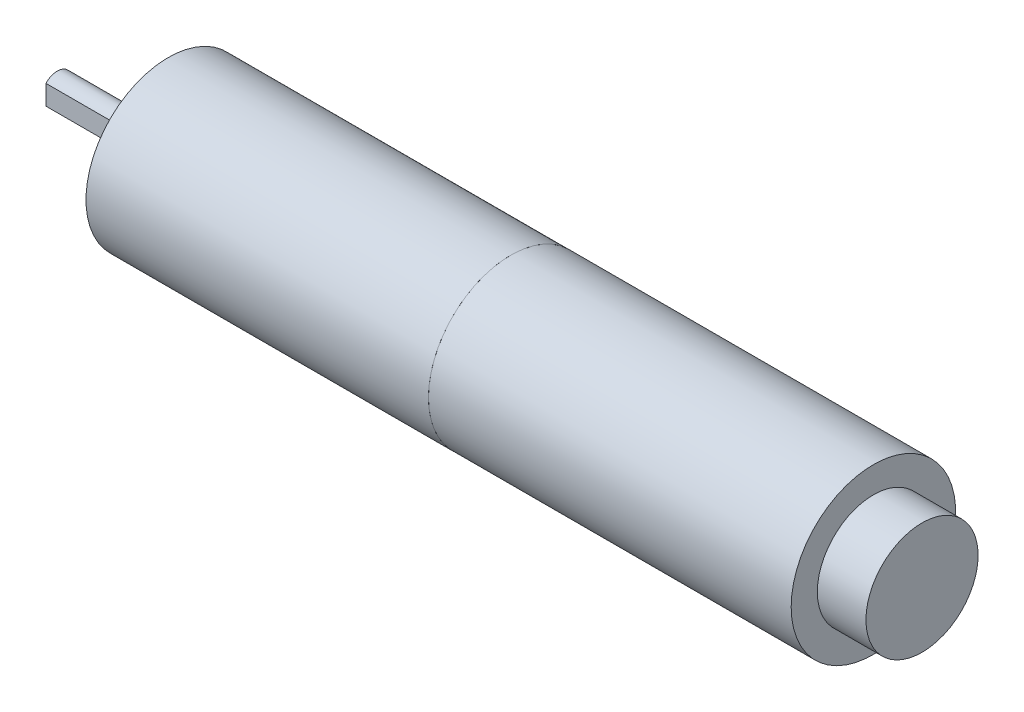
ISO-10303-21;
HEADER;
FILE_DESCRIPTION(('STEP AP214'),'2;1');
FILE_NAME('part.step','',(''),(''),'','','');
FILE_SCHEMA(('AUTOMOTIVE_DESIGN { 1 0 10303 214 1 1 1 1 }'));
ENDSEC;
DATA;
#1=APPLICATION_CONTEXT('core data for automotive mechanical design processes');
#2=APPLICATION_PROTOCOL_DEFINITION('international standard','automotive_design',2000,#1);
#3=PRODUCT_CONTEXT('',#1,'mechanical');
#4=PRODUCT('Part','Part','',(#3));
#5=PRODUCT_RELATED_PRODUCT_CATEGORY('part','',(#4));
#6=PRODUCT_DEFINITION_FORMATION('','',#4);
#7=PRODUCT_DEFINITION_CONTEXT('part definition',#1,'design');
#8=PRODUCT_DEFINITION('design','',#6,#7);
#9=PRODUCT_DEFINITION_SHAPE('','',#8);
#10=(LENGTH_UNIT() NAMED_UNIT(*) SI_UNIT(.MILLI.,.METRE.));
#11=(NAMED_UNIT(*) PLANE_ANGLE_UNIT() SI_UNIT($,.RADIAN.));
#12=(NAMED_UNIT(*) SI_UNIT($,.STERADIAN.) SOLID_ANGLE_UNIT());
#13=UNCERTAINTY_MEASURE_WITH_UNIT(LENGTH_MEASURE(1.E-05),#10,'distance_accuracy_value','');
#14=(GEOMETRIC_REPRESENTATION_CONTEXT(3) GLOBAL_UNCERTAINTY_ASSIGNED_CONTEXT((#13)) GLOBAL_UNIT_ASSIGNED_CONTEXT((#10,
#11,#12)) REPRESENTATION_CONTEXT('',''));
#15=CARTESIAN_POINT('',(0.,0.,0.));
#16=DIRECTION('',(0.,0.,1.));
#17=DIRECTION('',(1.,0.,0.));
#18=AXIS2_PLACEMENT_3D('',#15,#16,#17);
#19=CARTESIAN_POINT('',(100.8,0.,0.));
#20=DIRECTION('',(-1.,0.,0.));
#21=DIRECTION('',(0.,0.,1.));
#22=AXIS2_PLACEMENT_3D('',#19,#20,#21);
#23=CYLINDRICAL_SURFACE('',#22,7.5);
#24=CARTESIAN_POINT('',(100.8,0.,0.));
#25=DIRECTION('',(1.,0.,0.));
#26=DIRECTION('',(0.,0.,-1.));
#27=AXIS2_PLACEMENT_3D('',#24,#25,#26);
#28=CIRCLE('',#27,7.5);
#29=CARTESIAN_POINT('',(100.8,0.,7.50000000000001));
#30=VERTEX_POINT('',#29);
#31=EDGE_CURVE('P0_E11',#30,#30,#28,.T.);
#32=CARTESIAN_POINT('',(94.3,0.,0.));
#33=DIRECTION('',(1.,0.,0.));
#34=DIRECTION('',(0.,0.,-1.));
#35=AXIS2_PLACEMENT_3D('',#32,#33,#34);
#36=CIRCLE('',#35,7.5);
#37=CARTESIAN_POINT('',(94.3,0.,7.50000000000001));
#38=VERTEX_POINT('',#37);
#39=EDGE_CURVE('P0_E43',#38,#38,#36,.T.);
#40=CARTESIAN_POINT('',(100.8,0.,7.50000000000001));
#41=CARTESIAN_POINT('',(100.732291666667,0.,7.50000000000001));
#42=CARTESIAN_POINT('',(100.664583333333,0.,7.50000000000001));
#43=CARTESIAN_POINT('',(100.529166666667,0.,7.50000000000001));
#44=CARTESIAN_POINT('',(100.461458333333,0.,7.50000000000001));
#45=CARTESIAN_POINT('',(100.326041666667,0.,7.50000000000001));
#46=CARTESIAN_POINT('',(100.258333333333,0.,7.50000000000001));
#47=CARTESIAN_POINT('',(100.122916666667,0.,7.50000000000001));
#48=CARTESIAN_POINT('',(100.055208333333,0.,7.50000000000001));
#49=CARTESIAN_POINT('',(99.9197916666667,0.,7.50000000000001));
#50=CARTESIAN_POINT('',(99.8520833333333,0.,7.50000000000001));
#51=CARTESIAN_POINT('',(99.7166666666667,0.,7.50000000000001));
#52=CARTESIAN_POINT('',(99.6489583333333,0.,7.50000000000001));
#53=CARTESIAN_POINT('',(99.5135416666667,0.,7.50000000000001));
#54=CARTESIAN_POINT('',(99.4458333333333,0.,7.50000000000001));
#55=CARTESIAN_POINT('',(99.3104166666667,0.,7.50000000000001));
#56=CARTESIAN_POINT('',(99.2427083333333,0.,7.50000000000001));
#57=CARTESIAN_POINT('',(99.1072916666667,0.,7.50000000000001));
#58=CARTESIAN_POINT('',(99.0395833333333,0.,7.50000000000001));
#59=CARTESIAN_POINT('',(98.9041666666667,0.,7.50000000000001));
#60=CARTESIAN_POINT('',(98.8364583333333,0.,7.50000000000001));
#61=CARTESIAN_POINT('',(98.7010416666667,0.,7.50000000000001));
#62=CARTESIAN_POINT('',(98.6333333333333,0.,7.50000000000001));
#63=CARTESIAN_POINT('',(98.4979166666667,0.,7.50000000000001));
#64=CARTESIAN_POINT('',(98.4302083333333,0.,7.50000000000001));
#65=CARTESIAN_POINT('',(98.2947916666667,0.,7.50000000000001));
#66=CARTESIAN_POINT('',(98.2270833333333,0.,7.50000000000001));
#67=CARTESIAN_POINT('',(98.0916666666667,0.,7.50000000000001));
#68=CARTESIAN_POINT('',(98.0239583333333,0.,7.50000000000001));
#69=CARTESIAN_POINT('',(97.8885416666667,0.,7.50000000000001));
#70=CARTESIAN_POINT('',(97.8208333333333,0.,7.50000000000001));
#71=CARTESIAN_POINT('',(97.6854166666667,0.,7.50000000000001));
#72=CARTESIAN_POINT('',(97.6177083333333,0.,7.50000000000001));
#73=CARTESIAN_POINT('',(97.4822916666667,0.,7.50000000000001));
#74=CARTESIAN_POINT('',(97.4145833333333,0.,7.50000000000001));
#75=CARTESIAN_POINT('',(97.2791666666667,0.,7.50000000000001));
#76=CARTESIAN_POINT('',(97.2114583333333,0.,7.50000000000001));
#77=CARTESIAN_POINT('',(97.0760416666667,0.,7.50000000000001));
#78=CARTESIAN_POINT('',(97.0083333333333,0.,7.50000000000001));
#79=CARTESIAN_POINT('',(96.8729166666667,0.,7.50000000000001));
#80=CARTESIAN_POINT('',(96.8052083333333,0.,7.50000000000001));
#81=CARTESIAN_POINT('',(96.6697916666667,0.,7.50000000000001));
#82=CARTESIAN_POINT('',(96.6020833333333,0.,7.50000000000001));
#83=CARTESIAN_POINT('',(96.4666666666667,0.,7.50000000000001));
#84=CARTESIAN_POINT('',(96.3989583333333,0.,7.50000000000001));
#85=CARTESIAN_POINT('',(96.2635416666667,0.,7.50000000000001));
#86=CARTESIAN_POINT('',(96.1958333333333,0.,7.50000000000001));
#87=CARTESIAN_POINT('',(96.0604166666667,0.,7.50000000000001));
#88=CARTESIAN_POINT('',(95.9927083333333,0.,7.50000000000001));
#89=CARTESIAN_POINT('',(95.8572916666667,0.,7.50000000000001));
#90=CARTESIAN_POINT('',(95.7895833333333,0.,7.50000000000001));
#91=CARTESIAN_POINT('',(95.6541666666667,0.,7.50000000000001));
#92=CARTESIAN_POINT('',(95.5864583333333,0.,7.50000000000001));
#93=CARTESIAN_POINT('',(95.4510416666667,0.,7.50000000000001));
#94=CARTESIAN_POINT('',(95.3833333333333,0.,7.50000000000001));
#95=CARTESIAN_POINT('',(95.2479166666667,0.,7.50000000000001));
#96=CARTESIAN_POINT('',(95.1802083333333,0.,7.50000000000001));
#97=CARTESIAN_POINT('',(95.0447916666667,0.,7.50000000000001));
#98=CARTESIAN_POINT('',(94.9770833333333,0.,7.50000000000001));
#99=CARTESIAN_POINT('',(94.8416666666667,0.,7.50000000000001));
#100=CARTESIAN_POINT('',(94.7739583333333,0.,7.50000000000001));
#101=CARTESIAN_POINT('',(94.6385416666667,0.,7.50000000000001));
#102=CARTESIAN_POINT('',(94.5708333333333,0.,7.50000000000001));
#103=CARTESIAN_POINT('',(94.4354166666667,0.,7.50000000000001));
#104=CARTESIAN_POINT('',(94.3677083333333,0.,7.50000000000001));
#105=CARTESIAN_POINT('',(94.3,0.,7.50000000000001));
#106=B_SPLINE_CURVE_WITH_KNOTS('',3,(#40,#41,#42,#43,#44,#45,#46,#47,#48,#49,#50,#51,#52,#53,
#54,#55,#56,#57,#58,#59,#60,#61,#62,#63,#64,#65,#66,#67,#68,#69,#70,#71,#72,#73,#74,#75,#76,#77,
#78,#79,#80,#81,#82,#83,#84,#85,#86,#87,#88,#89,#90,#91,#92,#93,#94,#95,#96,#97,#98,#99,#100,
#101,#102,#103,#104,#105),.UNSPECIFIED.,.F.,.F.,(4,2,2,2,2,2,2,2,2,2,2,2,2,2,2,2,2,2,2,2,2,2,2,
2,2,2,2,2,2,2,2,2,4),(0.,0.203124999999998,0.406249999999997,0.609374999999995,
0.812499999999994,1.01562499999999,1.21874999999999,1.42187499999999,1.625,1.828125,2.03125,
2.234375,2.4375,2.64062499999999,2.84374999999999,3.04687499999999,3.25,3.453125,3.65625,
3.859375,4.0625,4.26562499999999,4.46874999999999,4.67187499999999,4.875,5.078125,5.28125,
5.484375,5.6875,5.890625,6.09374999999999,6.29687499999999,6.50000000000001),.UNSPECIFIED.);
#107=EDGE_CURVE('P0_BSEAM40',#30,#38,#106,.T.);
#108=ORIENTED_EDGE('',*,*,#31,.F.);
#109=ORIENTED_EDGE('',*,*,#39,.T.);
#110=ORIENTED_EDGE('',*,*,#107,.T.);
#111=ORIENTED_EDGE('',*,*,#107,.F.);
#112=EDGE_LOOP('',(#108,#110,#109,#111));
#113=FACE_BOUND('',#112,.T.);
#114=ADVANCED_FACE('P0_F40',(#113),#23,.T.);
#115=CARTESIAN_POINT('',(100.8,0.,0.));
#116=DIRECTION('',(1.,0.,0.));
#117=DIRECTION('',(0.,0.,-1.));
#118=AXIS2_PLACEMENT_3D('',#115,#116,#117);
#119=PLANE('',#118);
#120=ORIENTED_EDGE('',*,*,#31,.T.);
#121=EDGE_LOOP('',(#120));
#122=FACE_BOUND('',#121,.T.);
#123=ADVANCED_FACE('P0_F55',(#122),#119,.T.);
#124=CARTESIAN_POINT('',(94.3,0.,0.));
#125=DIRECTION('',(1.,0.,0.));
#126=DIRECTION('',(0.,0.,-1.));
#127=AXIS2_PLACEMENT_3D('',#124,#125,#126);
#128=PLANE('',#127);
#129=ORIENTED_EDGE('',*,*,#39,.F.);
#130=EDGE_LOOP('',(#129));
#131=FACE_BOUND('',#130,.T.);
#132=ADVANCED_FACE('P0_F53',(#131),#128,.F.);
#133=CLOSED_SHELL('',(#114,#123,#132));
#134=MANIFOLD_SOLID_BREP('P0_B2',#133);
#135=CARTESIAN_POINT('',(94.3,0.,0.));
#136=DIRECTION('',(-1.,0.,0.));
#137=DIRECTION('',(0.,0.,1.));
#138=AXIS2_PLACEMENT_3D('',#135,#136,#137);
#139=CYLINDRICAL_SURFACE('',#138,11.);
#140=CARTESIAN_POINT('',(94.3,0.,0.));
#141=DIRECTION('',(1.,0.,0.));
#142=DIRECTION('',(0.,0.,-1.));
#143=AXIS2_PLACEMENT_3D('',#140,#141,#142);
#144=CIRCLE('',#143,11.);
#145=CARTESIAN_POINT('',(94.3,0.,11.));
#146=VERTEX_POINT('',#145);
#147=EDGE_CURVE('P0_E39',#146,#146,#144,.T.);
#148=CARTESIAN_POINT('',(45.8,0.,0.));
#149=DIRECTION('',(1.,0.,0.));
#150=DIRECTION('',(0.,0.,-1.));
#151=AXIS2_PLACEMENT_3D('',#148,#149,#150);
#152=CIRCLE('',#151,11.);
#153=CARTESIAN_POINT('',(45.8,0.,11.));
#154=VERTEX_POINT('',#153);
#155=EDGE_CURVE('P0_E83',#154,#154,#152,.T.);
#156=CARTESIAN_POINT('',(94.3,0.,11.));
#157=CARTESIAN_POINT('',(93.7947916666667,0.,11.));
#158=CARTESIAN_POINT('',(93.2895833333333,0.,11.));
#159=CARTESIAN_POINT('',(92.2791666666667,0.,11.));
#160=CARTESIAN_POINT('',(91.7739583333333,0.,11.));
#161=CARTESIAN_POINT('',(90.7635416666667,0.,11.));
#162=CARTESIAN_POINT('',(90.2583333333333,0.,11.));
#163=CARTESIAN_POINT('',(89.2479166666667,0.,11.));
#164=CARTESIAN_POINT('',(88.7427083333333,0.,11.));
#165=CARTESIAN_POINT('',(87.7322916666667,0.,11.));
#166=CARTESIAN_POINT('',(87.2270833333333,0.,11.));
#167=CARTESIAN_POINT('',(86.2166666666667,0.,11.));
#168=CARTESIAN_POINT('',(85.7114583333333,0.,11.));
#169=CARTESIAN_POINT('',(84.7010416666667,0.,11.));
#170=CARTESIAN_POINT('',(84.1958333333333,0.,11.));
#171=CARTESIAN_POINT('',(83.1854166666667,0.,11.));
#172=CARTESIAN_POINT('',(82.6802083333333,0.,11.));
#173=CARTESIAN_POINT('',(81.6697916666667,0.,11.));
#174=CARTESIAN_POINT('',(81.1645833333333,0.,11.));
#175=CARTESIAN_POINT('',(80.1541666666667,0.,11.));
#176=CARTESIAN_POINT('',(79.6489583333333,0.,11.));
#177=CARTESIAN_POINT('',(78.6385416666667,0.,11.));
#178=CARTESIAN_POINT('',(78.1333333333333,0.,11.));
#179=CARTESIAN_POINT('',(77.1229166666667,0.,11.));
#180=CARTESIAN_POINT('',(76.6177083333333,0.,11.));
#181=CARTESIAN_POINT('',(75.6072916666667,0.,11.));
#182=CARTESIAN_POINT('',(75.1020833333333,0.,11.));
#183=CARTESIAN_POINT('',(74.0916666666667,0.,11.));
#184=CARTESIAN_POINT('',(73.5864583333333,0.,11.));
#185=CARTESIAN_POINT('',(72.5760416666667,0.,11.));
#186=CARTESIAN_POINT('',(72.0708333333333,0.,11.));
#187=CARTESIAN_POINT('',(71.0604166666667,0.,11.));
#188=CARTESIAN_POINT('',(70.5552083333333,0.,11.));
#189=CARTESIAN_POINT('',(69.5447916666667,0.,11.));
#190=CARTESIAN_POINT('',(69.0395833333333,0.,11.));
#191=CARTESIAN_POINT('',(68.0291666666667,0.,11.));
#192=CARTESIAN_POINT('',(67.5239583333333,0.,11.));
#193=CARTESIAN_POINT('',(66.5135416666667,0.,11.));
#194=CARTESIAN_POINT('',(66.0083333333333,0.,11.));
#195=CARTESIAN_POINT('',(64.9979166666667,0.,11.));
#196=CARTESIAN_POINT('',(64.4927083333333,0.,11.));
#197=CARTESIAN_POINT('',(63.4822916666667,0.,11.));
#198=CARTESIAN_POINT('',(62.9770833333333,0.,11.));
#199=CARTESIAN_POINT('',(61.9666666666667,0.,11.));
#200=CARTESIAN_POINT('',(61.4614583333333,0.,11.));
#201=CARTESIAN_POINT('',(60.4510416666667,0.,11.));
#202=CARTESIAN_POINT('',(59.9458333333333,0.,11.));
#203=CARTESIAN_POINT('',(58.9354166666667,0.,11.));
#204=CARTESIAN_POINT('',(58.4302083333333,0.,11.));
#205=CARTESIAN_POINT('',(57.4197916666667,0.,11.));
#206=CARTESIAN_POINT('',(56.9145833333333,0.,11.));
#207=CARTESIAN_POINT('',(55.9041666666667,0.,11.));
#208=CARTESIAN_POINT('',(55.3989583333333,0.,11.));
#209=CARTESIAN_POINT('',(54.3885416666667,0.,11.));
#210=CARTESIAN_POINT('',(53.8833333333333,0.,11.));
#211=CARTESIAN_POINT('',(52.8729166666667,0.,11.));
#212=CARTESIAN_POINT('',(52.3677083333333,0.,11.));
#213=CARTESIAN_POINT('',(51.3572916666667,0.,11.));
#214=CARTESIAN_POINT('',(50.8520833333333,0.,11.));
#215=CARTESIAN_POINT('',(49.8416666666667,0.,11.));
#216=CARTESIAN_POINT('',(49.3364583333333,0.,11.));
#217=CARTESIAN_POINT('',(48.3260416666667,0.,11.));
#218=CARTESIAN_POINT('',(47.8208333333333,0.,11.));
#219=CARTESIAN_POINT('',(46.8104166666667,0.,11.));
#220=CARTESIAN_POINT('',(46.3052083333333,0.,11.));
#221=CARTESIAN_POINT('',(45.8,0.,11.));
#222=B_SPLINE_CURVE_WITH_KNOTS('',3,(#156,#157,#158,#159,#160,#161,#162,#163,#164,#165,#166,
#167,#168,#169,#170,#171,#172,#173,#174,#175,#176,#177,#178,#179,#180,#181,#182,#183,#184,#185,
#186,#187,#188,#189,#190,#191,#192,#193,#194,#195,#196,#197,#198,#199,#200,#201,#202,#203,#204,
#205,#206,#207,#208,#209,#210,#211,#212,#213,#214,#215,#216,#217,#218,#219,#220,#221),
.UNSPECIFIED.,.F.,.F.,(4,2,2,2,2,2,2,2,2,2,2,2,2,2,2,2,2,2,2,2,2,2,2,2,2,2,2,2,2,2,2,2,4),(0.,
1.51562499999999,3.03125,4.54687499999999,6.06249999999998,7.57812499999999,9.09375,10.609375,
12.125,13.640625,15.15625,16.671875,18.1875,19.703125,21.21875,22.734375,24.25,25.765625,
27.28125,28.796875,30.3125,31.828125,33.34375,34.859375,36.375,37.890625,39.40625,40.921875,
42.4375,43.953125,45.46875,46.984375,48.5),.UNSPECIFIED.);
#223=EDGE_CURVE('P0_BSEAM80',#146,#154,#222,.T.);
#224=ORIENTED_EDGE('',*,*,#147,.F.);
#225=ORIENTED_EDGE('',*,*,#155,.T.);
#226=ORIENTED_EDGE('',*,*,#223,.T.);
#227=ORIENTED_EDGE('',*,*,#223,.F.);
#228=EDGE_LOOP('',(#224,#226,#225,#227));
#229=FACE_BOUND('',#228,.T.);
#230=ADVANCED_FACE('P0_F80',(#229),#139,.T.);
#231=CARTESIAN_POINT('',(94.3,0.,0.));
#232=DIRECTION('',(1.,0.,0.));
#233=DIRECTION('',(0.,0.,-1.));
#234=AXIS2_PLACEMENT_3D('',#231,#232,#233);
#235=PLANE('',#234);
#236=ORIENTED_EDGE('',*,*,#147,.T.);
#237=EDGE_LOOP('',(#236));
#238=FACE_BOUND('',#237,.T.);
#239=ADVANCED_FACE('P0_F95',(#238),#235,.T.);
#240=CARTESIAN_POINT('',(45.8,0.,0.));
#241=DIRECTION('',(1.,0.,0.));
#242=DIRECTION('',(0.,0.,-1.));
#243=AXIS2_PLACEMENT_3D('',#240,#241,#242);
#244=PLANE('',#243);
#245=ORIENTED_EDGE('',*,*,#155,.F.);
#246=EDGE_LOOP('',(#245));
#247=FACE_BOUND('',#246,.T.);
#248=ADVANCED_FACE('P0_F93',(#247),#244,.F.);
#249=CLOSED_SHELL('',(#230,#239,#248));
#250=MANIFOLD_SOLID_BREP('P0_B6',#249);
#251=CARTESIAN_POINT('',(45.80000001,7.36121593217,-4.25));
#252=DIRECTION('',(-1.,0.,0.));
#253=DIRECTION('',(0.,-1.,0.));
#254=AXIS2_PLACEMENT_3D('',#251,#252,#253);
#255=CYLINDRICAL_SURFACE('',#254,1.05);
#256=CARTESIAN_POINT('',(42.8,7.36121593217,-4.25));
#257=DIRECTION('',(-1.,0.,0.));
#258=DIRECTION('',(0.,-1.,0.));
#259=AXIS2_PLACEMENT_3D('',#256,#257,#258);
#260=CIRCLE('',#259,1.05);
#261=CARTESIAN_POINT('',(42.8,6.31121593217,-4.25));
#262=VERTEX_POINT('',#261);
#263=EDGE_CURVE('P1_E11',#262,#262,#260,.F.);
#264=ORIENTED_EDGE('',*,*,#263,.F.);
#265=EDGE_LOOP('',(#264));
#266=FACE_BOUND('',#265,.T.);
#267=CARTESIAN_POINT('',(45.8,7.36121593217,-4.25));
#268=DIRECTION('',(-1.,0.,0.));
#269=DIRECTION('',(0.,-1.,0.));
#270=AXIS2_PLACEMENT_3D('',#267,#268,#269);
#271=CIRCLE('',#270,1.05);
#272=CARTESIAN_POINT('',(45.8,6.31121593217,-4.25));
#273=VERTEX_POINT('',#272);
#274=EDGE_CURVE('P1_E95',#273,#273,#271,.T.);
#275=ORIENTED_EDGE('',*,*,#274,.F.);
#276=EDGE_LOOP('',(#275));
#277=FACE_BOUND('',#276,.T.);
#278=ADVANCED_FACE('P1_F16',(#266,#277),#255,.F.);
#279=CARTESIAN_POINT('',(45.80000001,-7.36121593217,-4.25));
#280=DIRECTION('',(-1.,0.,0.));
#281=DIRECTION('',(0.,-1.,0.));
#282=AXIS2_PLACEMENT_3D('',#279,#280,#281);
#283=CYLINDRICAL_SURFACE('',#282,1.05);
#284=CARTESIAN_POINT('',(42.8,-7.36121593217,-4.25));
#285=DIRECTION('',(-1.,0.,0.));
#286=DIRECTION('',(0.,-1.,0.));
#287=AXIS2_PLACEMENT_3D('',#284,#285,#286);
#288=CIRCLE('',#287,1.05);
#289=CARTESIAN_POINT('',(42.8,-8.41121593217,-4.25));
#290=VERTEX_POINT('',#289);
#291=EDGE_CURVE('P1_E22',#290,#290,#288,.F.);
#292=ORIENTED_EDGE('',*,*,#291,.F.);
#293=EDGE_LOOP('',(#292));
#294=FACE_BOUND('',#293,.T.);
#295=CARTESIAN_POINT('',(45.8,-7.36121593217,-4.25));
#296=DIRECTION('',(-1.,0.,0.));
#297=DIRECTION('',(0.,-1.,0.));
#298=AXIS2_PLACEMENT_3D('',#295,#296,#297);
#299=CIRCLE('',#298,1.05);
#300=CARTESIAN_POINT('',(45.8,-8.41121593217,-4.25));
#301=VERTEX_POINT('',#300);
#302=EDGE_CURVE('P1_E92',#301,#301,#299,.T.);
#303=ORIENTED_EDGE('',*,*,#302,.F.);
#304=EDGE_LOOP('',(#303));
#305=FACE_BOUND('',#304,.T.);
#306=ADVANCED_FACE('P1_F112',(#294,#305),#283,.F.);
#307=CARTESIAN_POINT('',(45.80000001,0.,8.5));
#308=DIRECTION('',(-1.,0.,0.));
#309=DIRECTION('',(0.,-1.,0.));
#310=AXIS2_PLACEMENT_3D('',#307,#308,#309);
#311=CYLINDRICAL_SURFACE('',#310,1.05);
#312=CARTESIAN_POINT('',(42.8,0.,8.5));
#313=DIRECTION('',(-1.,0.,0.));
#314=DIRECTION('',(0.,-1.,0.));
#315=AXIS2_PLACEMENT_3D('',#312,#313,#314);
#316=CIRCLE('',#315,1.05);
#317=CARTESIAN_POINT('',(42.8,-1.05,8.5));
#318=VERTEX_POINT('',#317);
#319=EDGE_CURVE('P1_E102',#318,#318,#316,.F.);
#320=ORIENTED_EDGE('',*,*,#319,.F.);
#321=EDGE_LOOP('',(#320));
#322=FACE_BOUND('',#321,.T.);
#323=CARTESIAN_POINT('',(45.8,0.,8.5));
#324=DIRECTION('',(-1.,0.,0.));
#325=DIRECTION('',(0.,-1.,0.));
#326=AXIS2_PLACEMENT_3D('',#323,#324,#325);
#327=CIRCLE('',#326,1.05);
#328=CARTESIAN_POINT('',(45.8,-1.05,8.5));
#329=VERTEX_POINT('',#328);
#330=EDGE_CURVE('P1_E89',#329,#329,#327,.T.);
#331=ORIENTED_EDGE('',*,*,#330,.F.);
#332=EDGE_LOOP('',(#331));
#333=FACE_BOUND('',#332,.T.);
#334=ADVANCED_FACE('P1_F115',(#322,#333),#311,.F.);
#335=CARTESIAN_POINT('',(45.80000001,0.,0.));
#336=DIRECTION('',(-1.,0.,0.));
#337=DIRECTION('',(0.,-1.,0.));
#338=AXIS2_PLACEMENT_3D('',#335,#336,#337);
#339=CYLINDRICAL_SURFACE('',#338,3.5);
#340=CARTESIAN_POINT('',(39.4,0.,0.));
#341=DIRECTION('',(-1.,0.,0.));
#342=DIRECTION('',(0.,-1.,0.));
#343=AXIS2_PLACEMENT_3D('',#340,#341,#342);
#344=CIRCLE('',#343,3.5);
#345=CARTESIAN_POINT('',(39.4,-3.5,0.));
#346=VERTEX_POINT('',#345);
#347=EDGE_CURVE('P1_E98',#346,#346,#344,.F.);
#348=ORIENTED_EDGE('',*,*,#347,.F.);
#349=EDGE_LOOP('',(#348));
#350=FACE_BOUND('',#349,.T.);
#351=CARTESIAN_POINT('',(45.8,0.,0.));
#352=DIRECTION('',(-1.,0.,0.));
#353=DIRECTION('',(0.,-1.,0.));
#354=AXIS2_PLACEMENT_3D('',#351,#352,#353);
#355=CIRCLE('',#354,3.5);
#356=CARTESIAN_POINT('',(45.8,-3.5,0.));
#357=VERTEX_POINT('',#356);
#358=EDGE_CURVE('P1_E86',#357,#357,#355,.T.);
#359=ORIENTED_EDGE('',*,*,#358,.F.);
#360=EDGE_LOOP('',(#359));
#361=FACE_BOUND('',#360,.T.);
#362=ADVANCED_FACE('P1_F122',(#350,#361),#339,.F.);
#363=CARTESIAN_POINT('',(45.8,0.,11.));
#364=DIRECTION('',(1.,0.,0.));
#365=DIRECTION('',(0.,0.,-1.));
#366=AXIS2_PLACEMENT_3D('',#363,#364,#365);
#367=PLANE('',#366);
#368=ORIENTED_EDGE('',*,*,#358,.T.);
#369=EDGE_LOOP('',(#368));
#370=FACE_BOUND('',#369,.T.);
#371=ORIENTED_EDGE('',*,*,#330,.T.);
#372=EDGE_LOOP('',(#371));
#373=FACE_BOUND('',#372,.T.);
#374=ORIENTED_EDGE('',*,*,#302,.T.);
#375=EDGE_LOOP('',(#374));
#376=FACE_BOUND('',#375,.T.);
#377=ORIENTED_EDGE('',*,*,#274,.T.);
#378=EDGE_LOOP('',(#377));
#379=FACE_BOUND('',#378,.T.);
#380=CARTESIAN_POINT('',(45.8,0.,0.));
#381=DIRECTION('',(1.,0.,0.));
#382=DIRECTION('',(0.,0.,-1.));
#383=AXIS2_PLACEMENT_3D('',#380,#381,#382);
#384=CIRCLE('',#383,11.);
#385=CARTESIAN_POINT('',(45.8,0.,-11.));
#386=VERTEX_POINT('',#385);
#387=EDGE_CURVE('P1_E83',#386,#386,#384,.F.);
#388=ORIENTED_EDGE('',*,*,#387,.F.);
#389=EDGE_LOOP('',(#388));
#390=FACE_BOUND('',#389,.T.);
#391=ADVANCED_FACE('P1_F118',(#370,#373,#376,#379,#390),#367,.T.);
#392=CARTESIAN_POINT('',(1.59999999,0.,0.));
#393=DIRECTION('',(1.,0.,0.));
#394=DIRECTION('',(0.,0.,-1.));
#395=AXIS2_PLACEMENT_3D('',#392,#393,#394);
#396=CYLINDRICAL_SURFACE('',#395,11.);
#397=CARTESIAN_POINT('',(0.,0.,0.));
#398=DIRECTION('',(1.,0.,0.));
#399=DIRECTION('',(0.,0.,-1.));
#400=AXIS2_PLACEMENT_3D('',#397,#398,#399);
#401=CIRCLE('',#400,11.);
#402=CARTESIAN_POINT('',(0.,0.,-11.));
#403=VERTEX_POINT('',#402);
#404=EDGE_CURVE('P1_E68',#403,#403,#401,.T.);
#405=ORIENTED_EDGE('',*,*,#404,.T.);
#406=EDGE_LOOP('',(#405));
#407=FACE_BOUND('',#406,.T.);
#408=ORIENTED_EDGE('',*,*,#387,.T.);
#409=EDGE_LOOP('',(#408));
#410=FACE_BOUND('',#409,.T.);
#411=ADVANCED_FACE('P1_F121',(#407,#410),#396,.T.);
#412=CARTESIAN_POINT('',(-9.99999993922529E-09,6.06217782649,-3.5));
#413=DIRECTION('',(1.,0.,0.));
#414=DIRECTION('',(0.,0.,-1.));
#415=AXIS2_PLACEMENT_3D('',#412,#413,#414);
#416=CYLINDRICAL_SURFACE('',#415,0.975);
#417=CARTESIAN_POINT('',(6.5,6.06217782649,-3.5));
#418=DIRECTION('',(1.,0.,0.));
#419=DIRECTION('',(0.,0.,-1.));
#420=AXIS2_PLACEMENT_3D('',#417,#418,#419);
#421=CIRCLE('',#420,0.975);
#422=CARTESIAN_POINT('',(6.5,6.06217782649,-4.475));
#423=VERTEX_POINT('',#422);
#424=EDGE_CURVE('P1_E79',#423,#423,#421,.F.);
#425=ORIENTED_EDGE('',*,*,#424,.F.);
#426=EDGE_LOOP('',(#425));
#427=FACE_BOUND('',#426,.T.);
#428=CARTESIAN_POINT('',(0.,6.06217782649,-3.5));
#429=DIRECTION('',(1.,0.,0.));
#430=DIRECTION('',(0.,0.,-1.));
#431=AXIS2_PLACEMENT_3D('',#428,#429,#430);
#432=CIRCLE('',#431,0.975);
#433=CARTESIAN_POINT('',(0.,6.06217782649,-4.475));
#434=VERTEX_POINT('',#433);
#435=EDGE_CURVE('P1_E65',#434,#434,#432,.T.);
#436=ORIENTED_EDGE('',*,*,#435,.F.);
#437=EDGE_LOOP('',(#436));
#438=FACE_BOUND('',#437,.T.);
#439=ADVANCED_FACE('P1_F130',(#427,#438),#416,.F.);
#440=CARTESIAN_POINT('',(-9.99999993922529E-09,-6.06217782649,-3.5));
#441=DIRECTION('',(1.,0.,0.));
#442=DIRECTION('',(0.,0.,-1.));
#443=AXIS2_PLACEMENT_3D('',#440,#441,#442);
#444=CYLINDRICAL_SURFACE('',#443,0.975);
#445=CARTESIAN_POINT('',(6.5,-6.06217782649,-3.5));
#446=DIRECTION('',(1.,0.,0.));
#447=DIRECTION('',(0.,0.,-1.));
#448=AXIS2_PLACEMENT_3D('',#445,#446,#447);
#449=CIRCLE('',#448,0.975);
#450=CARTESIAN_POINT('',(6.5,-6.06217782649,-4.475));
#451=VERTEX_POINT('',#450);
#452=EDGE_CURVE('P1_E75',#451,#451,#449,.F.);
#453=ORIENTED_EDGE('',*,*,#452,.F.);
#454=EDGE_LOOP('',(#453));
#455=FACE_BOUND('',#454,.T.);
#456=CARTESIAN_POINT('',(0.,-6.06217782649,-3.5));
#457=DIRECTION('',(1.,0.,0.));
#458=DIRECTION('',(0.,0.,-1.));
#459=AXIS2_PLACEMENT_3D('',#456,#457,#458);
#460=CIRCLE('',#459,0.975);
#461=CARTESIAN_POINT('',(0.,-6.06217782649,-4.475));
#462=VERTEX_POINT('',#461);
#463=EDGE_CURVE('P1_E58',#462,#462,#460,.T.);
#464=ORIENTED_EDGE('',*,*,#463,.F.);
#465=EDGE_LOOP('',(#464));
#466=FACE_BOUND('',#465,.T.);
#467=ADVANCED_FACE('P1_F137',(#455,#466),#444,.F.);
#468=CARTESIAN_POINT('',(-9.99999993922529E-09,0.,7.));
#469=DIRECTION('',(1.,0.,0.));
#470=DIRECTION('',(0.,0.,-1.));
#471=AXIS2_PLACEMENT_3D('',#468,#469,#470);
#472=CYLINDRICAL_SURFACE('',#471,0.975);
#473=CARTESIAN_POINT('',(6.5,0.,7.));
#474=DIRECTION('',(1.,0.,0.));
#475=DIRECTION('',(0.,0.,-1.));
#476=AXIS2_PLACEMENT_3D('',#473,#474,#475);
#477=CIRCLE('',#476,0.975);
#478=CARTESIAN_POINT('',(6.5,0.,6.025));
#479=VERTEX_POINT('',#478);
#480=EDGE_CURVE('P1_E71',#479,#479,#477,.F.);
#481=ORIENTED_EDGE('',*,*,#480,.F.);
#482=EDGE_LOOP('',(#481));
#483=FACE_BOUND('',#482,.T.);
#484=CARTESIAN_POINT('',(0.,0.,7.));
#485=DIRECTION('',(1.,0.,0.));
#486=DIRECTION('',(0.,0.,-1.));
#487=AXIS2_PLACEMENT_3D('',#484,#485,#486);
#488=CIRCLE('',#487,0.975);
#489=CARTESIAN_POINT('',(0.,0.,6.025));
#490=VERTEX_POINT('',#489);
#491=EDGE_CURVE('P1_E54',#490,#490,#488,.T.);
#492=ORIENTED_EDGE('',*,*,#491,.F.);
#493=EDGE_LOOP('',(#492));
#494=FACE_BOUND('',#493,.T.);
#495=ADVANCED_FACE('P1_F192',(#483,#494),#472,.F.);
#496=CARTESIAN_POINT('',(0.,0.,11.));
#497=DIRECTION('',(-1.,0.,0.));
#498=DIRECTION('',(0.,-1.,0.));
#499=AXIS2_PLACEMENT_3D('',#496,#497,#498);
#500=PLANE('',#499);
#501=CARTESIAN_POINT('',(0.,0.,0.));
#502=DIRECTION('',(1.,0.,0.));
#503=DIRECTION('',(0.,0.,-1.));
#504=AXIS2_PLACEMENT_3D('',#501,#502,#503);
#505=CIRCLE('',#504,5.);
#506=CARTESIAN_POINT('',(0.,0.,-5.));
#507=VERTEX_POINT('',#506);
#508=EDGE_CURVE('P1_E333',#507,#507,#505,.T.);
#509=ORIENTED_EDGE('',*,*,#508,.T.);
#510=EDGE_LOOP('',(#509));
#511=FACE_BOUND('',#510,.T.);
#512=ORIENTED_EDGE('',*,*,#491,.T.);
#513=EDGE_LOOP('',(#512));
#514=FACE_BOUND('',#513,.T.);
#515=ORIENTED_EDGE('',*,*,#463,.T.);
#516=EDGE_LOOP('',(#515));
#517=FACE_BOUND('',#516,.T.);
#518=ORIENTED_EDGE('',*,*,#435,.T.);
#519=EDGE_LOOP('',(#518));
#520=FACE_BOUND('',#519,.T.);
#521=ORIENTED_EDGE('',*,*,#404,.F.);
#522=EDGE_LOOP('',(#521));
#523=FACE_BOUND('',#522,.T.);
#524=ADVANCED_FACE('P1_F201',(#511,#514,#517,#520,#523),#500,.T.);
#525=CARTESIAN_POINT('',(-14.85,1.32287565553,1.5));
#526=DIRECTION('',(-1.,0.,0.));
#527=DIRECTION('',(0.,-1.,0.));
#528=AXIS2_PLACEMENT_3D('',#525,#526,#527);
#529=PLANE('',#528);
#530=DIRECTION('',(0.,-1.,0.));
#531=VECTOR('',#530,1.);
#532=CARTESIAN_POINT('',(-14.85,1.32287565553,1.5));
#533=LINE('',#532,#531);
#534=CARTESIAN_POINT('',(-14.85,-1.32287565553165,1.50000000000057));
#535=VERTEX_POINT('',#534);
#536=CARTESIAN_POINT('',(-14.85,1.32287565553165,1.50000000000057));
#537=VERTEX_POINT('',#536);
#538=EDGE_CURVE('P1_E51',#535,#537,#533,.F.);
#539=ORIENTED_EDGE('',*,*,#538,.T.);
#540=CARTESIAN_POINT('',(-14.85,0.,0.));
#541=DIRECTION('',(-1.,0.,0.));
#542=DIRECTION('',(0.,0.,1.));
#543=AXIS2_PLACEMENT_3D('',#540,#541,#542);
#544=CIRCLE('',#543,2.);
#545=EDGE_CURVE('P1_E43',#535,#537,#544,.F.);
#546=ORIENTED_EDGE('',*,*,#545,.F.);
#547=EDGE_LOOP('',(#539,#546));
#548=FACE_BOUND('',#547,.T.);
#549=ADVANCED_FACE('P1_F50',(#548),#529,.T.);
#550=CARTESIAN_POINT('',(-5.85,-1.32287565553,1.5));
#551=DIRECTION('',(-0.707106781186547,0.,0.707106781186548));
#552=DIRECTION('',(0.707106781186548,0.,0.707106781186547));
#553=AXIS2_PLACEMENT_3D('',#550,#551,#552);
#554=PLANE('',#553);
#555=CARTESIAN_POINT('',(-7.35,0.,0.));
#556=DIRECTION('',(-0.707106781186547,0.,0.707106781186548));
#557=DIRECTION('',(-0.707106781186548,0.,-0.707106781186547));
#558=AXIS2_PLACEMENT_3D('',#555,#556,#557);
#559=ELLIPSE('',#558,2.82842712474619,2.);
#560=CARTESIAN_POINT('',(-5.84999999999943,1.32287565553165,1.50000000000057));
#561=VERTEX_POINT('',#560);
#562=CARTESIAN_POINT('',(-5.84999999999943,-1.32287565553165,1.50000000000057));
#563=VERTEX_POINT('',#562);
#564=EDGE_CURVE('P1_E44',#561,#563,#559,.F.);
#565=ORIENTED_EDGE('',*,*,#564,.F.);
#566=DIRECTION('',(0.,1.,0.));
#567=VECTOR('',#566,1.);
#568=CARTESIAN_POINT('',(-5.85,1.32287565553,1.5));
#569=LINE('',#568,#567);
#570=EDGE_CURVE('P1_E55',#563,#561,#569,.T.);
#571=ORIENTED_EDGE('',*,*,#570,.F.);
#572=EDGE_LOOP('',(#565,#571));
#573=FACE_BOUND('',#572,.T.);
#574=ADVANCED_FACE('P1_F220',(#573),#554,.T.);
#575=CARTESIAN_POINT('',(-14.85,1.32287565553,1.5));
#576=DIRECTION('',(0.,0.,1.));
#577=DIRECTION('',(1.,0.,0.));
#578=AXIS2_PLACEMENT_3D('',#575,#576,#577);
#579=PLANE('',#578);
#580=ORIENTED_EDGE('',*,*,#570,.T.);
#581=DIRECTION('',(-1.,0.,0.));
#582=VECTOR('',#581,1.);
#583=CARTESIAN_POINT('',(-3.14999999,1.322875655531,1.50000000000114));
#584=LINE('',#583,#582);
#585=EDGE_CURVE('P1_E36',#537,#561,#584,.F.);
#586=ORIENTED_EDGE('',*,*,#585,.F.);
#587=ORIENTED_EDGE('',*,*,#538,.F.);
#588=DIRECTION('',(-1.,0.,0.));
#589=VECTOR('',#588,1.);
#590=CARTESIAN_POINT('',(-3.14999999,-1.322875655531,1.50000000000114));
#591=LINE('',#590,#589);
#592=EDGE_CURVE('P1_E29',#563,#535,#591,.T.);
#593=ORIENTED_EDGE('',*,*,#592,.F.);
#594=EDGE_LOOP('',(#580,#586,#587,#593));
#595=FACE_BOUND('',#594,.T.);
#596=ADVANCED_FACE('P1_F53',(#595),#579,.T.);
#597=CARTESIAN_POINT('',(-3.14999999,0.,0.));
#598=DIRECTION('',(-1.,0.,0.));
#599=DIRECTION('',(0.,0.,1.));
#600=AXIS2_PLACEMENT_3D('',#597,#598,#599);
#601=CYLINDRICAL_SURFACE('',#600,2.);
#602=CARTESIAN_POINT('',(-3.15,0.,0.));
#603=DIRECTION('',(-1.,0.,0.));
#604=DIRECTION('',(0.,0.,1.));
#605=AXIS2_PLACEMENT_3D('',#602,#603,#604);
#606=CIRCLE('',#605,2.);
#607=CARTESIAN_POINT('',(-3.15,0.,2.));
#608=VERTEX_POINT('',#607);
#609=EDGE_CURVE('P1_E46',#608,#608,#606,.F.);
#610=ORIENTED_EDGE('',*,*,#609,.F.);
#611=EDGE_LOOP('',(#610));
#612=FACE_BOUND('',#611,.T.);
#613=ORIENTED_EDGE('',*,*,#592,.T.);
#614=ORIENTED_EDGE('',*,*,#545,.T.);
#615=ORIENTED_EDGE('',*,*,#585,.T.);
#616=ORIENTED_EDGE('',*,*,#564,.T.);
#617=EDGE_LOOP('',(#613,#614,#615,#616));
#618=FACE_BOUND('',#617,.T.);
#619=ADVANCED_FACE('P1_F42',(#612,#618),#601,.T.);
#620=CARTESIAN_POINT('',(-3.15,-3.5,0.));
#621=DIRECTION('',(-1.,0.,0.));
#622=DIRECTION('',(0.,-1.,0.));
#623=AXIS2_PLACEMENT_3D('',#620,#621,#622);
#624=PLANE('',#623);
#625=ORIENTED_EDGE('',*,*,#609,.T.);
#626=EDGE_LOOP('',(#625));
#627=FACE_BOUND('',#626,.T.);
#628=CARTESIAN_POINT('',(-3.15,0.,0.));
#629=DIRECTION('',(-1.,0.,0.));
#630=DIRECTION('',(0.,-1.,0.));
#631=AXIS2_PLACEMENT_3D('',#628,#629,#630);
#632=CIRCLE('',#631,3.5);
#633=CARTESIAN_POINT('',(-3.15,-3.5,0.));
#634=VERTEX_POINT('',#633);
#635=EDGE_CURVE('P1_E337',#634,#634,#632,.F.);
#636=ORIENTED_EDGE('',*,*,#635,.F.);
#637=EDGE_LOOP('',(#636));
#638=FACE_BOUND('',#637,.T.);
#639=ADVANCED_FACE('P1_F246',(#627,#638),#624,.T.);
#640=CARTESIAN_POINT('',(-1.34999999,0.,0.));
#641=DIRECTION('',(-1.,0.,0.));
#642=DIRECTION('',(0.,-1.,0.));
#643=AXIS2_PLACEMENT_3D('',#640,#641,#642);
#644=CYLINDRICAL_SURFACE('',#643,3.5);
#645=ORIENTED_EDGE('',*,*,#635,.T.);
#646=EDGE_LOOP('',(#645));
#647=FACE_BOUND('',#646,.T.);
#648=CARTESIAN_POINT('',(-1.35,0.,0.));
#649=DIRECTION('',(-1.,0.,0.));
#650=DIRECTION('',(0.,-1.,0.));
#651=AXIS2_PLACEMENT_3D('',#648,#649,#650);
#652=CIRCLE('',#651,3.5);
#653=CARTESIAN_POINT('',(-1.35,-3.5,0.));
#654=VERTEX_POINT('',#653);
#655=EDGE_CURVE('P1_E334',#654,#654,#652,.F.);
#656=ORIENTED_EDGE('',*,*,#655,.F.);
#657=EDGE_LOOP('',(#656));
#658=FACE_BOUND('',#657,.T.);
#659=ADVANCED_FACE('P1_F256',(#647,#658),#644,.T.);
#660=CARTESIAN_POINT('',(-1.35,5.,0.));
#661=DIRECTION('',(-1.,0.,0.));
#662=DIRECTION('',(0.,-1.,0.));
#663=AXIS2_PLACEMENT_3D('',#660,#661,#662);
#664=PLANE('',#663);
#665=ORIENTED_EDGE('',*,*,#655,.T.);
#666=EDGE_LOOP('',(#665));
#667=FACE_BOUND('',#666,.T.);
#668=CARTESIAN_POINT('',(-1.35,0.,0.));
#669=DIRECTION('',(1.,0.,0.));
#670=DIRECTION('',(0.,0.,-1.));
#671=AXIS2_PLACEMENT_3D('',#668,#669,#670);
#672=CIRCLE('',#671,5.);
#673=CARTESIAN_POINT('',(-1.35,0.,-5.));
#674=VERTEX_POINT('',#673);
#675=EDGE_CURVE('P1_E330',#674,#674,#672,.T.);
#676=ORIENTED_EDGE('',*,*,#675,.F.);
#677=EDGE_LOOP('',(#676));
#678=FACE_BOUND('',#677,.T.);
#679=ADVANCED_FACE('P1_F266',(#667,#678),#664,.T.);
#680=CARTESIAN_POINT('',(-1.35000001,0.,0.));
#681=DIRECTION('',(1.,0.,0.));
#682=DIRECTION('',(0.,0.,-1.));
#683=AXIS2_PLACEMENT_3D('',#680,#681,#682);
#684=CYLINDRICAL_SURFACE('',#683,5.);
#685=ORIENTED_EDGE('',*,*,#675,.T.);
#686=EDGE_LOOP('',(#685));
#687=FACE_BOUND('',#686,.T.);
#688=ORIENTED_EDGE('',*,*,#508,.F.);
#689=EDGE_LOOP('',(#688));
#690=FACE_BOUND('',#689,.T.);
#691=ADVANCED_FACE('P1_F276',(#687,#690),#684,.T.);
#692=OPEN_SHELL('',(#278,#306,#334,#362,#391,#411,#439,#467,#495,#524,#549,#574,#596,#619,#639,
#659,#679,#691));
#693=SHELL_BASED_SURFACE_MODEL('P1_B1',(#692));
#694=ADVANCED_BREP_SHAPE_REPRESENTATION('',(#18,#134,#250),#14);
#695=MANIFOLD_SURFACE_SHAPE_REPRESENTATION('',(#18,#693),#14);
#696=SHAPE_REPRESENTATION('',(#18),#14);
#697=SHAPE_DEFINITION_REPRESENTATION(#9,#696);
#698=SHAPE_REPRESENTATION_RELATIONSHIP('','',#696,#694);
#699=SHAPE_REPRESENTATION_RELATIONSHIP('','',#696,#695);
ENDSEC;
END-ISO-10303-21;
